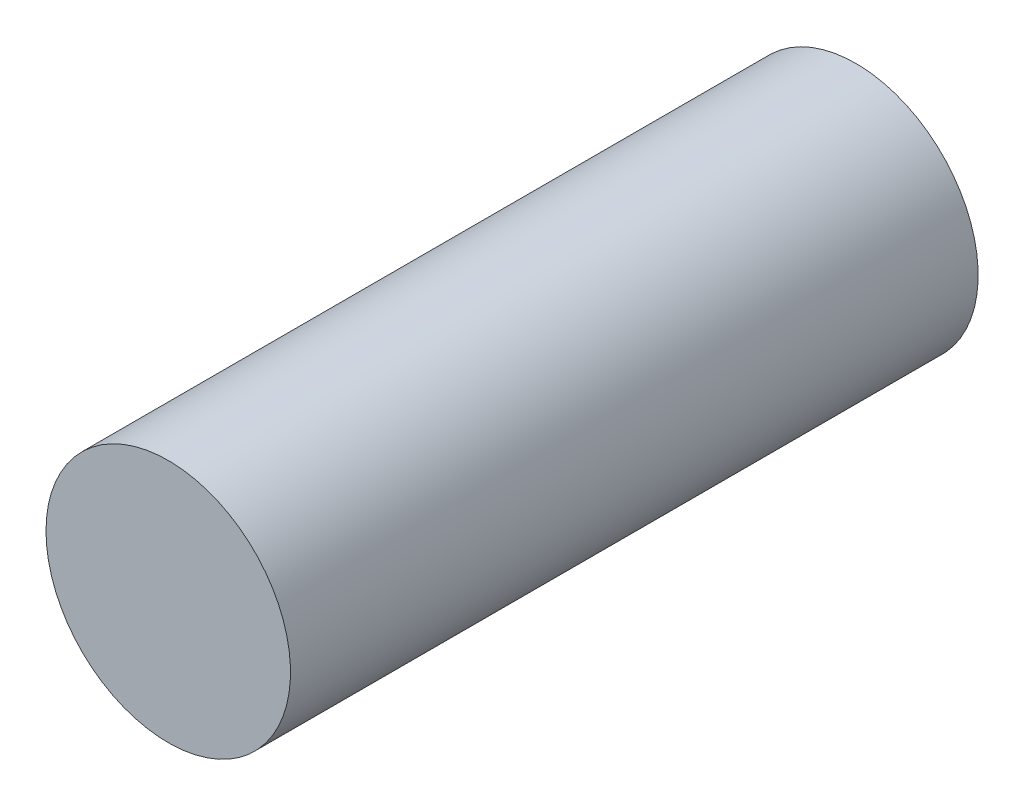
ISO-10303-21;
HEADER;
FILE_DESCRIPTION(('STEP AP214'),'2;1');
FILE_NAME('part.step','',(''),(''),'','','');
FILE_SCHEMA(('AUTOMOTIVE_DESIGN { 1 0 10303 214 1 1 1 1 }'));
ENDSEC;
DATA;
#1=APPLICATION_CONTEXT('core data for automotive mechanical design processes');
#2=APPLICATION_PROTOCOL_DEFINITION('international standard','automotive_design',2000,#1);
#3=PRODUCT_CONTEXT('',#1,'mechanical');
#4=PRODUCT('Part','Part','',(#3));
#5=PRODUCT_RELATED_PRODUCT_CATEGORY('part','',(#4));
#6=PRODUCT_DEFINITION_FORMATION('','',#4);
#7=PRODUCT_DEFINITION_CONTEXT('part definition',#1,'design');
#8=PRODUCT_DEFINITION('design','',#6,#7);
#9=PRODUCT_DEFINITION_SHAPE('','',#8);
#10=(LENGTH_UNIT() NAMED_UNIT(*) SI_UNIT(.MILLI.,.METRE.));
#11=(NAMED_UNIT(*) PLANE_ANGLE_UNIT() SI_UNIT($,.RADIAN.));
#12=(NAMED_UNIT(*) SI_UNIT($,.STERADIAN.) SOLID_ANGLE_UNIT());
#13=UNCERTAINTY_MEASURE_WITH_UNIT(LENGTH_MEASURE(1.E-05),#10,'distance_accuracy_value','');
#14=(GEOMETRIC_REPRESENTATION_CONTEXT(3) GLOBAL_UNCERTAINTY_ASSIGNED_CONTEXT((#13)) GLOBAL_UNIT_ASSIGNED_CONTEXT((#10,
#11,#12)) REPRESENTATION_CONTEXT('',''));
#15=CARTESIAN_POINT('',(0.,0.,0.));
#16=DIRECTION('',(0.,0.,1.));
#17=DIRECTION('',(1.,0.,0.));
#18=AXIS2_PLACEMENT_3D('',#15,#16,#17);
#19=CARTESIAN_POINT('',(0.,0.,45.));
#20=DIRECTION('',(0.,0.,-1.));
#21=DIRECTION('',(-1.,0.,0.));
#22=AXIS2_PLACEMENT_3D('',#19,#20,#21);
#23=CYLINDRICAL_SURFACE('',#22,8.);
#24=CARTESIAN_POINT('',(0.,0.,45.));
#25=DIRECTION('',(0.,0.,1.));
#26=DIRECTION('',(1.,0.,0.));
#27=AXIS2_PLACEMENT_3D('',#24,#25,#26);
#28=CIRCLE('',#27,8.);
#29=CARTESIAN_POINT('',(-8.,0.,45.));
#30=VERTEX_POINT('',#29);
#31=EDGE_CURVE('E10',#30,#30,#28,.T.);
#32=CARTESIAN_POINT('',(0.,0.,0.));
#33=DIRECTION('',(0.,0.,1.));
#34=DIRECTION('',(1.,0.,0.));
#35=AXIS2_PLACEMENT_3D('',#32,#33,#34);
#36=CIRCLE('',#35,8.);
#37=CARTESIAN_POINT('',(-8.,0.,0.));
#38=VERTEX_POINT('',#37);
#39=EDGE_CURVE('E44',#38,#38,#36,.T.);
#40=CARTESIAN_POINT('',(-8.,0.,45.));
#41=CARTESIAN_POINT('',(-8.,0.,44.53125));
#42=CARTESIAN_POINT('',(-8.,0.,44.0625));
#43=CARTESIAN_POINT('',(-8.,0.,43.125));
#44=CARTESIAN_POINT('',(-8.,0.,42.65625));
#45=CARTESIAN_POINT('',(-8.,0.,41.71875));
#46=CARTESIAN_POINT('',(-8.,0.,41.25));
#47=CARTESIAN_POINT('',(-8.,0.,40.3125));
#48=CARTESIAN_POINT('',(-8.,0.,39.84375));
#49=CARTESIAN_POINT('',(-8.,0.,38.90625));
#50=CARTESIAN_POINT('',(-8.,0.,38.4375));
#51=CARTESIAN_POINT('',(-8.,0.,37.5));
#52=CARTESIAN_POINT('',(-8.,0.,37.03125));
#53=CARTESIAN_POINT('',(-8.,0.,36.09375));
#54=CARTESIAN_POINT('',(-8.,0.,35.625));
#55=CARTESIAN_POINT('',(-8.,0.,34.6875));
#56=CARTESIAN_POINT('',(-8.,0.,34.21875));
#57=CARTESIAN_POINT('',(-8.,0.,33.28125));
#58=CARTESIAN_POINT('',(-8.,0.,32.8125));
#59=CARTESIAN_POINT('',(-8.,0.,31.875));
#60=CARTESIAN_POINT('',(-8.,0.,31.40625));
#61=CARTESIAN_POINT('',(-8.,0.,30.46875));
#62=CARTESIAN_POINT('',(-8.,0.,30.));
#63=CARTESIAN_POINT('',(-8.,0.,29.0625));
#64=CARTESIAN_POINT('',(-8.,0.,28.59375));
#65=CARTESIAN_POINT('',(-8.,0.,27.65625));
#66=CARTESIAN_POINT('',(-8.,0.,27.1875));
#67=CARTESIAN_POINT('',(-8.,0.,26.25));
#68=CARTESIAN_POINT('',(-8.,0.,25.78125));
#69=CARTESIAN_POINT('',(-8.,0.,24.84375));
#70=CARTESIAN_POINT('',(-8.,0.,24.375));
#71=CARTESIAN_POINT('',(-8.,0.,23.4375));
#72=CARTESIAN_POINT('',(-8.,0.,22.96875));
#73=CARTESIAN_POINT('',(-8.,0.,22.03125));
#74=CARTESIAN_POINT('',(-8.,0.,21.5625));
#75=CARTESIAN_POINT('',(-8.,0.,20.625));
#76=CARTESIAN_POINT('',(-8.,0.,20.15625));
#77=CARTESIAN_POINT('',(-8.,0.,19.21875));
#78=CARTESIAN_POINT('',(-8.,0.,18.75));
#79=CARTESIAN_POINT('',(-8.,0.,17.8125));
#80=CARTESIAN_POINT('',(-8.,0.,17.34375));
#81=CARTESIAN_POINT('',(-8.,0.,16.40625));
#82=CARTESIAN_POINT('',(-8.,0.,15.9375));
#83=CARTESIAN_POINT('',(-8.,0.,15.));
#84=CARTESIAN_POINT('',(-8.,0.,14.53125));
#85=CARTESIAN_POINT('',(-8.,0.,13.59375));
#86=CARTESIAN_POINT('',(-8.,0.,13.125));
#87=CARTESIAN_POINT('',(-8.,0.,12.1875));
#88=CARTESIAN_POINT('',(-8.,0.,11.71875));
#89=CARTESIAN_POINT('',(-8.,0.,10.78125));
#90=CARTESIAN_POINT('',(-8.,0.,10.3125));
#91=CARTESIAN_POINT('',(-8.,0.,9.375));
#92=CARTESIAN_POINT('',(-8.,0.,8.90625));
#93=CARTESIAN_POINT('',(-8.,0.,7.96874999999999));
#94=CARTESIAN_POINT('',(-8.,0.,7.5));
#95=CARTESIAN_POINT('',(-8.,0.,6.5625));
#96=CARTESIAN_POINT('',(-8.,0.,6.09375));
#97=CARTESIAN_POINT('',(-8.,0.,5.15625));
#98=CARTESIAN_POINT('',(-8.,0.,4.68749999999999));
#99=CARTESIAN_POINT('',(-8.,0.,3.74999999999999));
#100=CARTESIAN_POINT('',(-8.,0.,3.28124999999999));
#101=CARTESIAN_POINT('',(-8.,0.,2.34374999999999));
#102=CARTESIAN_POINT('',(-8.,0.,1.87499999999999));
#103=CARTESIAN_POINT('',(-8.,0.,0.937499999999992));
#104=CARTESIAN_POINT('',(-8.,0.,0.468749999999993));
#105=CARTESIAN_POINT('',(-8.,0.,0.));
#106=B_SPLINE_CURVE_WITH_KNOTS('',3,(#40,#41,#42,#43,#44,#45,#46,#47,#48,#49,#50,#51,#52,#53,
#54,#55,#56,#57,#58,#59,#60,#61,#62,#63,#64,#65,#66,#67,#68,#69,#70,#71,#72,#73,#74,#75,#76,#77,
#78,#79,#80,#81,#82,#83,#84,#85,#86,#87,#88,#89,#90,#91,#92,#93,#94,#95,#96,#97,#98,#99,#100,
#101,#102,#103,#104,#105),.UNSPECIFIED.,.F.,.F.,(4,2,2,2,2,2,2,2,2,2,2,2,2,2,2,2,2,2,2,2,2,2,2,
2,2,2,2,2,2,2,2,2,4),(0.,1.40625,2.8125,4.21875000000001,5.62500000000001,7.03125,8.4375,
9.84375000000001,11.25,12.65625,14.0625,15.46875,16.875,18.28125,19.6875,21.09375,22.5,23.90625,
25.3125,26.71875,28.125,29.53125,30.9375,32.34375,33.75,35.15625,36.5625,37.96875,39.375,
40.78125,42.1875,43.59375,45.),.UNSPECIFIED.);
#107=EDGE_CURVE('BSEAM41',#30,#38,#106,.T.);
#108=ORIENTED_EDGE('',*,*,#31,.F.);
#109=ORIENTED_EDGE('',*,*,#39,.T.);
#110=ORIENTED_EDGE('',*,*,#107,.T.);
#111=ORIENTED_EDGE('',*,*,#107,.F.);
#112=EDGE_LOOP('',(#108,#110,#109,#111));
#113=FACE_BOUND('',#112,.T.);
#114=ADVANCED_FACE('F41',(#113),#23,.T.);
#115=CARTESIAN_POINT('',(0.,0.,45.));
#116=DIRECTION('',(0.,0.,1.));
#117=DIRECTION('',(1.,0.,0.));
#118=AXIS2_PLACEMENT_3D('',#115,#116,#117);
#119=PLANE('',#118);
#120=ORIENTED_EDGE('',*,*,#31,.T.);
#121=EDGE_LOOP('',(#120));
#122=FACE_BOUND('',#121,.T.);
#123=ADVANCED_FACE('F58',(#122),#119,.T.);
#124=CARTESIAN_POINT('',(0.,0.,0.));
#125=DIRECTION('',(0.,0.,1.));
#126=DIRECTION('',(1.,0.,0.));
#127=AXIS2_PLACEMENT_3D('',#124,#125,#126);
#128=PLANE('',#127);
#129=ORIENTED_EDGE('',*,*,#39,.F.);
#130=EDGE_LOOP('',(#129));
#131=FACE_BOUND('',#130,.T.);
#132=ADVANCED_FACE('F56',(#131),#128,.F.);
#133=CLOSED_SHELL('',(#114,#123,#132));
#134=MANIFOLD_SOLID_BREP('B2',#133);
#135=ADVANCED_BREP_SHAPE_REPRESENTATION('',(#18,#134),#14);
#136=SHAPE_DEFINITION_REPRESENTATION(#9,#135);
ENDSEC;
END-ISO-10303-21;
